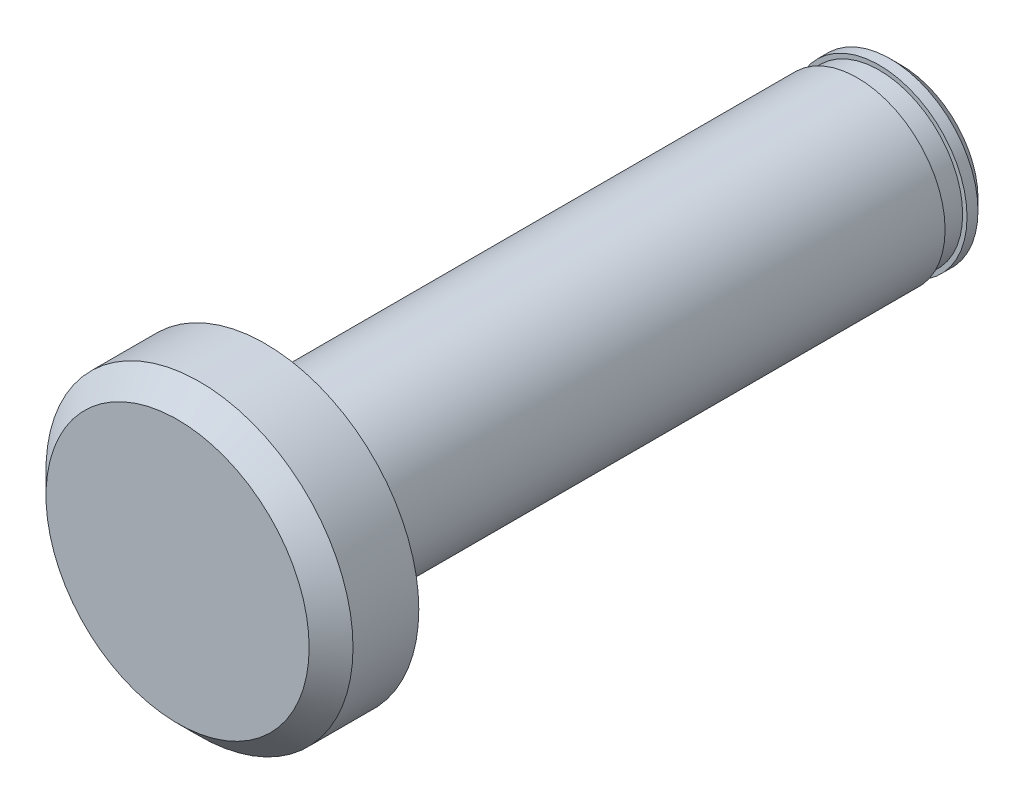
ISO-10303-21;
HEADER;
FILE_DESCRIPTION(('STEP AP214'),'2;1');
FILE_NAME('part.step','',(''),(''),'','','');
FILE_SCHEMA(('AUTOMOTIVE_DESIGN { 1 0 10303 214 1 1 1 1 }'));
ENDSEC;
DATA;
#1=APPLICATION_CONTEXT('core data for automotive mechanical design processes');
#2=APPLICATION_PROTOCOL_DEFINITION('international standard','automotive_design',2000,#1);
#3=PRODUCT_CONTEXT('',#1,'mechanical');
#4=PRODUCT('Part','Part','',(#3));
#5=PRODUCT_RELATED_PRODUCT_CATEGORY('part','',(#4));
#6=PRODUCT_DEFINITION_FORMATION('','',#4);
#7=PRODUCT_DEFINITION_CONTEXT('part definition',#1,'design');
#8=PRODUCT_DEFINITION('design','',#6,#7);
#9=PRODUCT_DEFINITION_SHAPE('','',#8);
#10=(LENGTH_UNIT() NAMED_UNIT(*) SI_UNIT(.MILLI.,.METRE.));
#11=(NAMED_UNIT(*) PLANE_ANGLE_UNIT() SI_UNIT($,.RADIAN.));
#12=(NAMED_UNIT(*) SI_UNIT($,.STERADIAN.) SOLID_ANGLE_UNIT());
#13=UNCERTAINTY_MEASURE_WITH_UNIT(LENGTH_MEASURE(1.E-05),#10,'distance_accuracy_value','');
#14=(GEOMETRIC_REPRESENTATION_CONTEXT(3) GLOBAL_UNCERTAINTY_ASSIGNED_CONTEXT((#13)) GLOBAL_UNIT_ASSIGNED_CONTEXT((#10,
#11,#12)) REPRESENTATION_CONTEXT('',''));
#15=CARTESIAN_POINT('',(0.,0.,0.));
#16=DIRECTION('',(0.,0.,1.));
#17=DIRECTION('',(1.,0.,0.));
#18=AXIS2_PLACEMENT_3D('',#15,#16,#17);
#19=CARTESIAN_POINT('',(-8.48858090341486,0.,38.9511504481003));
#20=DIRECTION('',(0.,0.,-1.));
#21=DIRECTION('',(-1.,0.,0.));
#22=AXIS2_PLACEMENT_3D('',#19,#20,#21);
#23=CONICAL_SURFACE('',#22,6.00000000000003,0.785398163397441);
#24=CARTESIAN_POINT('',(-8.48858090341486,0.,37.9511504481002));
#25=DIRECTION('',(0.,0.,1.));
#26=DIRECTION('',(1.,0.,0.));
#27=AXIS2_PLACEMENT_3D('',#24,#25,#26);
#28=CIRCLE('',#27,7.00000000000003);
#29=CARTESIAN_POINT('',(-1.48858090341484,0.,37.9511504481002));
#30=VERTEX_POINT('',#29);
#31=EDGE_CURVE('E64',#30,#30,#28,.T.);
#32=ORIENTED_EDGE('',*,*,#31,.T.);
#33=EDGE_LOOP('',(#32));
#34=FACE_BOUND('',#33,.T.);
#35=CARTESIAN_POINT('',(-8.48858090341486,0.,38.9511504481003));
#36=DIRECTION('',(0.,0.,1.));
#37=DIRECTION('',(1.,0.,0.));
#38=AXIS2_PLACEMENT_3D('',#35,#36,#37);
#39=CIRCLE('',#38,6.00000000000003);
#40=CARTESIAN_POINT('',(-2.48858090341483,0.,38.9511504481003));
#41=VERTEX_POINT('',#40);
#42=EDGE_CURVE('E10',#41,#41,#39,.T.);
#43=ORIENTED_EDGE('',*,*,#42,.F.);
#44=EDGE_LOOP('',(#43));
#45=FACE_BOUND('',#44,.T.);
#46=ADVANCED_FACE('F30',(#34,#45),#23,.T.);
#47=CARTESIAN_POINT('',(-14.4885809034149,0.,38.9511504481002));
#48=DIRECTION('',(0.,0.,-1.));
#49=DIRECTION('',(-1.,0.,0.));
#50=AXIS2_PLACEMENT_3D('',#47,#48,#49);
#51=PLANE('',#50);
#52=ORIENTED_EDGE('',*,*,#42,.T.);
#53=EDGE_LOOP('',(#52));
#54=FACE_BOUND('',#53,.T.);
#55=ADVANCED_FACE('F100',(#54),#51,.F.);
#56=CARTESIAN_POINT('',(-8.48858090341486,0.,5.95115044810024));
#57=DIRECTION('',(0.,0.,1.));
#58=DIRECTION('',(1.,0.,0.));
#59=AXIS2_PLACEMENT_3D('',#56,#57,#58);
#60=PLANE('',#59);
#61=CARTESIAN_POINT('',(-8.48858090341486,0.,5.95115044810023));
#62=DIRECTION('',(0.,0.,1.));
#63=DIRECTION('',(1.,0.,0.));
#64=AXIS2_PLACEMENT_3D('',#61,#62,#63);
#65=CIRCLE('',#64,3.50000000000002);
#66=CARTESIAN_POINT('',(-4.98858090341484,0.,5.95115044810023));
#67=VERTEX_POINT('',#66);
#68=EDGE_CURVE('E36',#67,#67,#65,.T.);
#69=ORIENTED_EDGE('',*,*,#68,.F.);
#70=EDGE_LOOP('',(#69));
#71=FACE_BOUND('',#70,.T.);
#72=ADVANCED_FACE('F104',(#71),#60,.F.);
#73=CARTESIAN_POINT('',(-8.48858090341486,0.,5.95115044810023));
#74=DIRECTION('',(0.,0.,1.));
#75=DIRECTION('',(1.,0.,0.));
#76=AXIS2_PLACEMENT_3D('',#73,#74,#75);
#77=CONICAL_SURFACE('',#76,3.50000000000002,0.785398163397428);
#78=CARTESIAN_POINT('',(-8.48858090341486,0.,6.45115044810023));
#79=DIRECTION('',(0.,0.,1.));
#80=DIRECTION('',(1.,0.,0.));
#81=AXIS2_PLACEMENT_3D('',#78,#79,#80);
#82=CIRCLE('',#81,4.);
#83=CARTESIAN_POINT('',(-4.48858090341486,0.,6.45115044810023));
#84=VERTEX_POINT('',#83);
#85=EDGE_CURVE('E40',#84,#84,#82,.T.);
#86=ORIENTED_EDGE('',*,*,#85,.F.);
#87=EDGE_LOOP('',(#86));
#88=FACE_BOUND('',#87,.T.);
#89=ORIENTED_EDGE('',*,*,#68,.T.);
#90=EDGE_LOOP('',(#89));
#91=FACE_BOUND('',#90,.T.);
#92=ADVANCED_FACE('F108',(#88,#91),#77,.T.);
#93=CARTESIAN_POINT('',(-8.48858090341486,0.,56.2933316261649));
#94=DIRECTION('',(0.,0.,1.));
#95=DIRECTION('',(1.,0.,0.));
#96=AXIS2_PLACEMENT_3D('',#93,#94,#95);
#97=CYLINDRICAL_SURFACE('',#96,4.00000000000001);
#98=CARTESIAN_POINT('',(-8.48858090341486,0.,6.95115044810025));
#99=DIRECTION('',(0.,0.,1.));
#100=DIRECTION('',(1.,0.,0.));
#101=AXIS2_PLACEMENT_3D('',#98,#99,#100);
#102=CIRCLE('',#101,4.00000000000002);
#103=CARTESIAN_POINT('',(-4.48858090341484,0.,6.95115044810025));
#104=VERTEX_POINT('',#103);
#105=EDGE_CURVE('E44',#104,#104,#102,.T.);
#106=ORIENTED_EDGE('',*,*,#105,.F.);
#107=EDGE_LOOP('',(#106));
#108=FACE_BOUND('',#107,.T.);
#109=ORIENTED_EDGE('',*,*,#85,.T.);
#110=EDGE_LOOP('',(#109));
#111=FACE_BOUND('',#110,.T.);
#112=ADVANCED_FACE('F114',(#108,#111),#97,.T.);
#113=CARTESIAN_POINT('',(-12.4885809034149,0.,6.95115044810025));
#114=DIRECTION('',(0.,0.,-1.));
#115=DIRECTION('',(-1.,0.,0.));
#116=AXIS2_PLACEMENT_3D('',#113,#114,#115);
#117=PLANE('',#116);
#118=CARTESIAN_POINT('',(-8.48858090341486,0.,6.95115044810025));
#119=DIRECTION('',(0.,0.,1.));
#120=DIRECTION('',(1.,0.,0.));
#121=AXIS2_PLACEMENT_3D('',#118,#119,#120);
#122=CIRCLE('',#121,3.80000000000002);
#123=CARTESIAN_POINT('',(-4.68858090341484,0.,6.95115044810025));
#124=VERTEX_POINT('',#123);
#125=EDGE_CURVE('E49',#124,#124,#122,.T.);
#126=ORIENTED_EDGE('',*,*,#125,.F.);
#127=EDGE_LOOP('',(#126));
#128=FACE_BOUND('',#127,.T.);
#129=ORIENTED_EDGE('',*,*,#105,.T.);
#130=EDGE_LOOP('',(#129));
#131=FACE_BOUND('',#130,.T.);
#132=ADVANCED_FACE('F96',(#128,#131),#117,.F.);
#133=CARTESIAN_POINT('',(-8.48858090341486,0.,56.2933316261649));
#134=DIRECTION('',(0.,0.,1.));
#135=DIRECTION('',(1.,0.,0.));
#136=AXIS2_PLACEMENT_3D('',#133,#134,#135);
#137=CYLINDRICAL_SURFACE('',#136,3.80000000000001);
#138=CARTESIAN_POINT('',(-8.48858090341486,0.,7.95115044810023));
#139=DIRECTION('',(0.,0.,1.));
#140=DIRECTION('',(1.,0.,0.));
#141=AXIS2_PLACEMENT_3D('',#138,#139,#140);
#142=CIRCLE('',#141,3.8);
#143=CARTESIAN_POINT('',(-4.68858090341486,0.,7.95115044810023));
#144=VERTEX_POINT('',#143);
#145=EDGE_CURVE('E52',#144,#144,#142,.T.);
#146=ORIENTED_EDGE('',*,*,#145,.F.);
#147=EDGE_LOOP('',(#146));
#148=FACE_BOUND('',#147,.T.);
#149=ORIENTED_EDGE('',*,*,#125,.T.);
#150=EDGE_LOOP('',(#149));
#151=FACE_BOUND('',#150,.T.);
#152=ADVANCED_FACE('F90',(#148,#151),#137,.T.);
#153=CARTESIAN_POINT('',(-12.4885809034149,0.,7.95115044810024));
#154=DIRECTION('',(0.,0.,-1.));
#155=DIRECTION('',(-1.,0.,0.));
#156=AXIS2_PLACEMENT_3D('',#153,#154,#155);
#157=PLANE('',#156);
#158=ORIENTED_EDGE('',*,*,#145,.T.);
#159=EDGE_LOOP('',(#158));
#160=FACE_BOUND('',#159,.T.);
#161=CARTESIAN_POINT('',(-8.48858090341486,0.,7.95115044810023));
#162=DIRECTION('',(0.,0.,1.));
#163=DIRECTION('',(1.,0.,0.));
#164=AXIS2_PLACEMENT_3D('',#161,#162,#163);
#165=CIRCLE('',#164,4.);
#166=CARTESIAN_POINT('',(-4.48858090341486,0.,7.95115044810023));
#167=VERTEX_POINT('',#166);
#168=EDGE_CURVE('E55',#167,#167,#165,.T.);
#169=ORIENTED_EDGE('',*,*,#168,.F.);
#170=EDGE_LOOP('',(#169));
#171=FACE_BOUND('',#170,.T.);
#172=ADVANCED_FACE('F85',(#160,#171),#157,.T.);
#173=CARTESIAN_POINT('',(-8.48858090341486,0.,56.2933316261649));
#174=DIRECTION('',(0.,0.,1.));
#175=DIRECTION('',(1.,0.,0.));
#176=AXIS2_PLACEMENT_3D('',#173,#174,#175);
#177=CYLINDRICAL_SURFACE('',#176,4.);
#178=CARTESIAN_POINT('',(-8.48858090341486,0.,34.9511504481002));
#179=DIRECTION('',(0.,0.,1.));
#180=DIRECTION('',(1.,0.,0.));
#181=AXIS2_PLACEMENT_3D('',#178,#179,#180);
#182=CIRCLE('',#181,4.);
#183=CARTESIAN_POINT('',(-4.48858090341487,0.,34.9511504481002));
#184=VERTEX_POINT('',#183);
#185=EDGE_CURVE('E58',#184,#184,#182,.T.);
#186=ORIENTED_EDGE('',*,*,#185,.F.);
#187=EDGE_LOOP('',(#186));
#188=FACE_BOUND('',#187,.T.);
#189=ORIENTED_EDGE('',*,*,#168,.T.);
#190=EDGE_LOOP('',(#189));
#191=FACE_BOUND('',#190,.T.);
#192=ADVANCED_FACE('F79',(#188,#191),#177,.T.);
#193=CARTESIAN_POINT('',(-12.4885809034149,0.,34.9511504481002));
#194=DIRECTION('',(0.,0.,1.));
#195=DIRECTION('',(1.,0.,0.));
#196=AXIS2_PLACEMENT_3D('',#193,#194,#195);
#197=PLANE('',#196);
#198=CARTESIAN_POINT('',(-8.48858090341486,0.,34.9511504481002));
#199=DIRECTION('',(0.,0.,1.));
#200=DIRECTION('',(1.,0.,0.));
#201=AXIS2_PLACEMENT_3D('',#198,#199,#200);
#202=CIRCLE('',#201,7.);
#203=CARTESIAN_POINT('',(-1.48858090341487,0.,34.9511504481002));
#204=VERTEX_POINT('',#203);
#205=EDGE_CURVE('E61',#204,#204,#202,.T.);
#206=ORIENTED_EDGE('',*,*,#205,.F.);
#207=EDGE_LOOP('',(#206));
#208=FACE_BOUND('',#207,.T.);
#209=ORIENTED_EDGE('',*,*,#185,.T.);
#210=EDGE_LOOP('',(#209));
#211=FACE_BOUND('',#210,.T.);
#212=ADVANCED_FACE('F73',(#208,#211),#197,.F.);
#213=CARTESIAN_POINT('',(-8.48858090341486,0.,56.2933316261649));
#214=DIRECTION('',(0.,0.,1.));
#215=DIRECTION('',(1.,0.,0.));
#216=AXIS2_PLACEMENT_3D('',#213,#214,#215);
#217=CYLINDRICAL_SURFACE('',#216,7.00000000000001);
#218=ORIENTED_EDGE('',*,*,#31,.F.);
#219=EDGE_LOOP('',(#218));
#220=FACE_BOUND('',#219,.T.);
#221=ORIENTED_EDGE('',*,*,#205,.T.);
#222=EDGE_LOOP('',(#221));
#223=FACE_BOUND('',#222,.T.);
#224=ADVANCED_FACE('F70',(#220,#223),#217,.T.);
#225=CLOSED_SHELL('',(#46,#55,#72,#92,#112,#132,#152,#172,#192,#212,#224));
#226=MANIFOLD_SOLID_BREP('B2',#225);
#227=ADVANCED_BREP_SHAPE_REPRESENTATION('',(#18,#226),#14);
#228=SHAPE_DEFINITION_REPRESENTATION(#9,#227);
ENDSEC;
END-ISO-10303-21;
